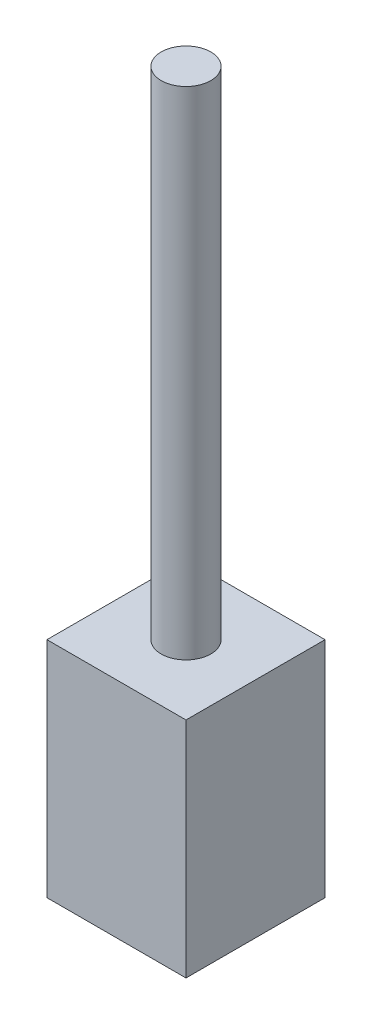
ISO-10303-21;
HEADER;
FILE_DESCRIPTION(('STEP AP214'),'2;1');
FILE_NAME('part.step','',(''),(''),'','','');
FILE_SCHEMA(('AUTOMOTIVE_DESIGN { 1 0 10303 214 1 1 1 1 }'));
ENDSEC;
DATA;
#1=APPLICATION_CONTEXT('core data for automotive mechanical design processes');
#2=APPLICATION_PROTOCOL_DEFINITION('international standard','automotive_design',2000,#1);
#3=PRODUCT_CONTEXT('',#1,'mechanical');
#4=PRODUCT('Part','Part','',(#3));
#5=PRODUCT_RELATED_PRODUCT_CATEGORY('part','',(#4));
#6=PRODUCT_DEFINITION_FORMATION('','',#4);
#7=PRODUCT_DEFINITION_CONTEXT('part definition',#1,'design');
#8=PRODUCT_DEFINITION('design','',#6,#7);
#9=PRODUCT_DEFINITION_SHAPE('','',#8);
#10=(LENGTH_UNIT() NAMED_UNIT(*) SI_UNIT(.MILLI.,.METRE.));
#11=(NAMED_UNIT(*) PLANE_ANGLE_UNIT() SI_UNIT($,.RADIAN.));
#12=(NAMED_UNIT(*) SI_UNIT($,.STERADIAN.) SOLID_ANGLE_UNIT());
#13=UNCERTAINTY_MEASURE_WITH_UNIT(LENGTH_MEASURE(1.E-05),#10,'distance_accuracy_value','');
#14=(GEOMETRIC_REPRESENTATION_CONTEXT(3) GLOBAL_UNCERTAINTY_ASSIGNED_CONTEXT((#13)) GLOBAL_UNIT_ASSIGNED_CONTEXT((#10,
#11,#12)) REPRESENTATION_CONTEXT('',''));
#15=CARTESIAN_POINT('',(0.,0.,0.));
#16=DIRECTION('',(0.,0.,1.));
#17=DIRECTION('',(1.,0.,0.));
#18=AXIS2_PLACEMENT_3D('',#15,#16,#17);
#19=CARTESIAN_POINT('',(0.,45.,0.));
#20=DIRECTION('',(0.,-1.,0.));
#21=DIRECTION('',(0.,0.,-1.));
#22=AXIS2_PLACEMENT_3D('',#19,#20,#21);
#23=PLANE('',#22);
#24=DIRECTION('',(0.,0.,1.));
#25=VECTOR('',#24,1.);
#26=CARTESIAN_POINT('',(0.,45.,0.));
#27=LINE('',#26,#25);
#28=CARTESIAN_POINT('',(0.,45.,-28.));
#29=VERTEX_POINT('',#28);
#30=CARTESIAN_POINT('',(0.,45.,0.));
#31=VERTEX_POINT('',#30);
#32=EDGE_CURVE('E86',#29,#31,#27,.T.);
#33=ORIENTED_EDGE('',*,*,#32,.T.);
#34=DIRECTION('',(1.,0.,0.));
#35=VECTOR('',#34,1.);
#36=CARTESIAN_POINT('',(0.,45.,0.));
#37=LINE('',#36,#35);
#38=CARTESIAN_POINT('',(28.,45.,0.));
#39=VERTEX_POINT('',#38);
#40=EDGE_CURVE('E81',#31,#39,#37,.T.);
#41=ORIENTED_EDGE('',*,*,#40,.T.);
#42=DIRECTION('',(0.,0.,-1.));
#43=VECTOR('',#42,1.);
#44=CARTESIAN_POINT('',(28.,45.,0.));
#45=LINE('',#44,#43);
#46=CARTESIAN_POINT('',(28.,45.,-28.));
#47=VERTEX_POINT('',#46);
#48=EDGE_CURVE('E84',#39,#47,#45,.T.);
#49=ORIENTED_EDGE('',*,*,#48,.T.);
#50=DIRECTION('',(-1.,0.,0.));
#51=VECTOR('',#50,1.);
#52=CARTESIAN_POINT('',(0.,45.,-28.));
#53=LINE('',#52,#51);
#54=EDGE_CURVE('E50',#47,#29,#53,.T.);
#55=ORIENTED_EDGE('',*,*,#54,.T.);
#56=EDGE_LOOP('',(#33,#41,#49,#55));
#57=FACE_BOUND('',#56,.T.);
#58=CARTESIAN_POINT('',(14.,45.,-14.));
#59=DIRECTION('',(0.,-1.,0.));
#60=DIRECTION('',(0.,0.,-1.));
#61=AXIS2_PLACEMENT_3D('',#58,#59,#60);
#62=CIRCLE('',#61,5.);
#63=CARTESIAN_POINT('',(14.,45.,-19.));
#64=VERTEX_POINT('',#63);
#65=EDGE_CURVE('E11',#64,#64,#62,.F.);
#66=ORIENTED_EDGE('',*,*,#65,.F.);
#67=EDGE_LOOP('',(#66));
#68=FACE_BOUND('',#67,.T.);
#69=ADVANCED_FACE('F33',(#57,#68),#23,.F.);
#70=CARTESIAN_POINT('',(0.,45.,0.));
#71=DIRECTION('',(1.,0.,0.));
#72=DIRECTION('',(0.,0.,-1.));
#73=AXIS2_PLACEMENT_3D('',#70,#71,#72);
#74=PLANE('',#73);
#75=DIRECTION('',(0.,0.,1.));
#76=VECTOR('',#75,1.);
#77=CARTESIAN_POINT('',(0.,0.,0.));
#78=LINE('',#77,#76);
#79=CARTESIAN_POINT('',(0.,0.,-28.));
#80=VERTEX_POINT('',#79);
#81=CARTESIAN_POINT('',(0.,0.,0.));
#82=VERTEX_POINT('',#81);
#83=EDGE_CURVE('E100',#80,#82,#78,.T.);
#84=ORIENTED_EDGE('',*,*,#83,.T.);
#85=DIRECTION('',(0.,-1.,0.));
#86=VECTOR('',#85,1.);
#87=CARTESIAN_POINT('',(0.,45.,0.));
#88=LINE('',#87,#86);
#89=EDGE_CURVE('E42',#31,#82,#88,.T.);
#90=ORIENTED_EDGE('',*,*,#89,.F.);
#91=ORIENTED_EDGE('',*,*,#32,.F.);
#92=DIRECTION('',(0.,-1.,0.));
#93=VECTOR('',#92,1.);
#94=CARTESIAN_POINT('',(0.,45.,-28.));
#95=LINE('',#94,#93);
#96=EDGE_CURVE('E96',#29,#80,#95,.T.);
#97=ORIENTED_EDGE('',*,*,#96,.T.);
#98=EDGE_LOOP('',(#84,#90,#91,#97));
#99=FACE_BOUND('',#98,.T.);
#100=ADVANCED_FACE('F35',(#99),#74,.F.);
#101=CARTESIAN_POINT('',(0.,45.,0.));
#102=DIRECTION('',(0.,0.,-1.));
#103=DIRECTION('',(-1.,0.,0.));
#104=AXIS2_PLACEMENT_3D('',#101,#102,#103);
#105=PLANE('',#104);
#106=DIRECTION('',(1.,0.,0.));
#107=VECTOR('',#106,1.);
#108=CARTESIAN_POINT('',(0.,0.,0.));
#109=LINE('',#108,#107);
#110=CARTESIAN_POINT('',(28.,0.,0.));
#111=VERTEX_POINT('',#110);
#112=EDGE_CURVE('E91',#82,#111,#109,.T.);
#113=ORIENTED_EDGE('',*,*,#112,.T.);
#114=DIRECTION('',(0.,-1.,0.));
#115=VECTOR('',#114,1.);
#116=CARTESIAN_POINT('',(28.,45.,0.));
#117=LINE('',#116,#115);
#118=EDGE_CURVE('E89',#39,#111,#117,.T.);
#119=ORIENTED_EDGE('',*,*,#118,.F.);
#120=ORIENTED_EDGE('',*,*,#40,.F.);
#121=ORIENTED_EDGE('',*,*,#89,.T.);
#122=EDGE_LOOP('',(#113,#119,#120,#121));
#123=FACE_BOUND('',#122,.T.);
#124=ADVANCED_FACE('F90',(#123),#105,.F.);
#125=CARTESIAN_POINT('',(28.,45.,0.));
#126=DIRECTION('',(-1.,0.,0.));
#127=DIRECTION('',(0.,0.,1.));
#128=AXIS2_PLACEMENT_3D('',#125,#126,#127);
#129=PLANE('',#128);
#130=DIRECTION('',(0.,0.,-1.));
#131=VECTOR('',#130,1.);
#132=CARTESIAN_POINT('',(28.,0.,0.));
#133=LINE('',#132,#131);
#134=CARTESIAN_POINT('',(28.,0.,-28.));
#135=VERTEX_POINT('',#134);
#136=EDGE_CURVE('E67',#111,#135,#133,.T.);
#137=ORIENTED_EDGE('',*,*,#136,.T.);
#138=DIRECTION('',(0.,-1.,0.));
#139=VECTOR('',#138,1.);
#140=CARTESIAN_POINT('',(28.,45.,-28.));
#141=LINE('',#140,#139);
#142=EDGE_CURVE('E92',#47,#135,#141,.T.);
#143=ORIENTED_EDGE('',*,*,#142,.F.);
#144=ORIENTED_EDGE('',*,*,#48,.F.);
#145=ORIENTED_EDGE('',*,*,#118,.T.);
#146=EDGE_LOOP('',(#137,#143,#144,#145));
#147=FACE_BOUND('',#146,.T.);
#148=ADVANCED_FACE('F94',(#147),#129,.F.);
#149=CARTESIAN_POINT('',(0.,45.,-28.));
#150=DIRECTION('',(0.,0.,1.));
#151=DIRECTION('',(1.,0.,0.));
#152=AXIS2_PLACEMENT_3D('',#149,#150,#151);
#153=PLANE('',#152);
#154=DIRECTION('',(-1.,0.,0.));
#155=VECTOR('',#154,1.);
#156=CARTESIAN_POINT('',(0.,0.,-28.));
#157=LINE('',#156,#155);
#158=EDGE_CURVE('E73',#135,#80,#157,.T.);
#159=ORIENTED_EDGE('',*,*,#158,.T.);
#160=ORIENTED_EDGE('',*,*,#96,.F.);
#161=ORIENTED_EDGE('',*,*,#54,.F.);
#162=ORIENTED_EDGE('',*,*,#142,.T.);
#163=EDGE_LOOP('',(#159,#160,#161,#162));
#164=FACE_BOUND('',#163,.T.);
#165=ADVANCED_FACE('F114',(#164),#153,.F.);
#166=CARTESIAN_POINT('',(0.,0.,0.));
#167=DIRECTION('',(0.,-1.,0.));
#168=DIRECTION('',(0.,0.,-1.));
#169=AXIS2_PLACEMENT_3D('',#166,#167,#168);
#170=PLANE('',#169);
#171=ORIENTED_EDGE('',*,*,#83,.F.);
#172=ORIENTED_EDGE('',*,*,#158,.F.);
#173=ORIENTED_EDGE('',*,*,#136,.F.);
#174=ORIENTED_EDGE('',*,*,#112,.F.);
#175=EDGE_LOOP('',(#171,#172,#173,#174));
#176=FACE_BOUND('',#175,.T.);
#177=ADVANCED_FACE('F111',(#176),#170,.T.);
#178=CARTESIAN_POINT('',(14.,145.,-14.));
#179=DIRECTION('',(0.,-1.,0.));
#180=DIRECTION('',(0.,0.,-1.));
#181=AXIS2_PLACEMENT_3D('',#178,#179,#180);
#182=CYLINDRICAL_SURFACE('',#181,5.);
#183=CARTESIAN_POINT('',(14.,145.,-14.));
#184=DIRECTION('',(0.,1.,0.));
#185=DIRECTION('',(0.,0.,1.));
#186=AXIS2_PLACEMENT_3D('',#183,#184,#185);
#187=CIRCLE('',#186,5.);
#188=CARTESIAN_POINT('',(14.,145.,-9.));
#189=VERTEX_POINT('',#188);
#190=EDGE_CURVE('E103',#189,#189,#187,.T.);
#191=ORIENTED_EDGE('',*,*,#190,.F.);
#192=EDGE_LOOP('',(#191));
#193=FACE_BOUND('',#192,.T.);
#194=ORIENTED_EDGE('',*,*,#65,.T.);
#195=EDGE_LOOP('',(#194));
#196=FACE_BOUND('',#195,.T.);
#197=ADVANCED_FACE('F113',(#193,#196),#182,.T.);
#198=CARTESIAN_POINT('',(14.,145.,-14.));
#199=DIRECTION('',(0.,1.,0.));
#200=DIRECTION('',(0.,0.,1.));
#201=AXIS2_PLACEMENT_3D('',#198,#199,#200);
#202=PLANE('',#201);
#203=ORIENTED_EDGE('',*,*,#190,.T.);
#204=EDGE_LOOP('',(#203));
#205=FACE_BOUND('',#204,.T.);
#206=ADVANCED_FACE('F120',(#205),#202,.T.);
#207=CLOSED_SHELL('',(#69,#100,#124,#148,#165,#177,#197,#206));
#208=MANIFOLD_SOLID_BREP('B2',#207);
#209=ADVANCED_BREP_SHAPE_REPRESENTATION('',(#18,#208),#14);
#210=SHAPE_DEFINITION_REPRESENTATION(#9,#209);
ENDSEC;
END-ISO-10303-21;
